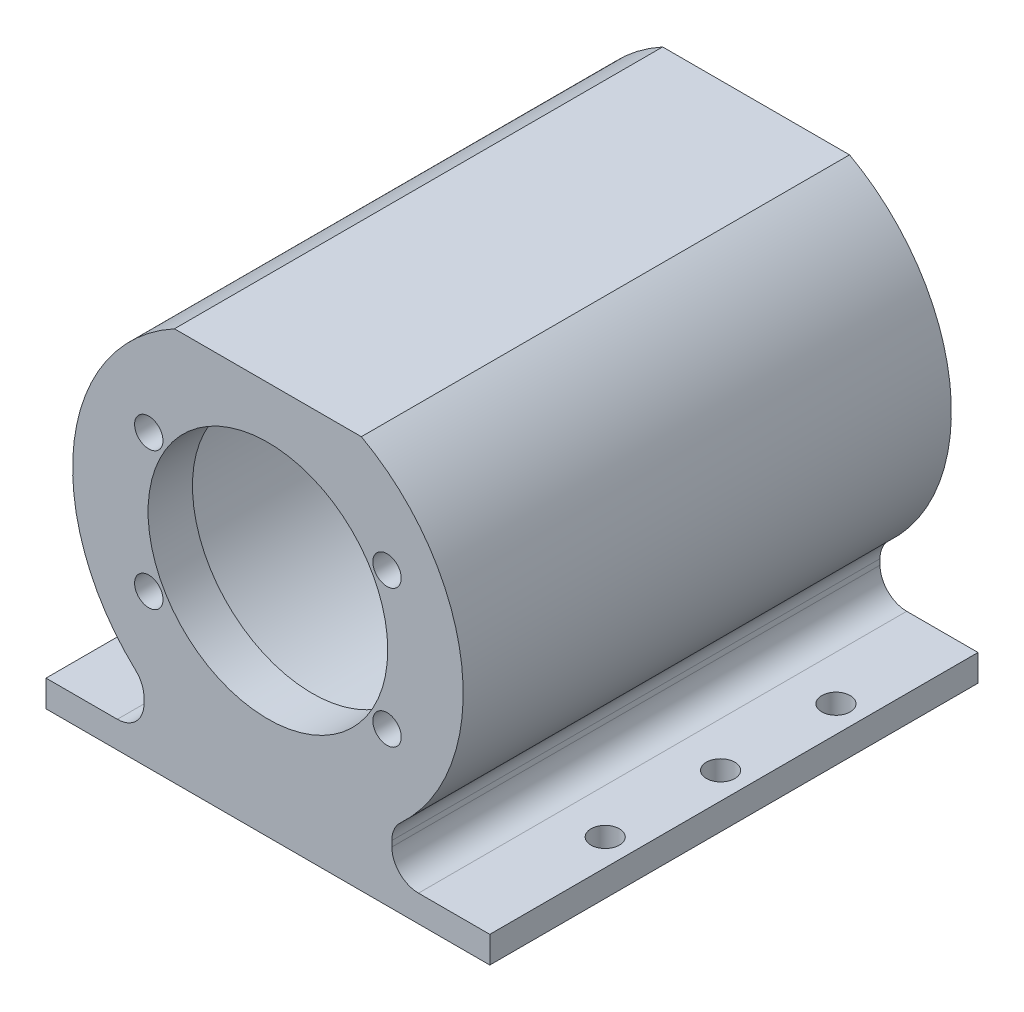
ISO-10303-21;
HEADER;
FILE_DESCRIPTION(('STEP AP214'),'2;1');
FILE_NAME('part.step','',(''),(''),'','','');
FILE_SCHEMA(('AUTOMOTIVE_DESIGN { 1 0 10303 214 1 1 1 1 }'));
ENDSEC;
DATA;
#1=APPLICATION_CONTEXT('core data for automotive mechanical design processes');
#2=APPLICATION_PROTOCOL_DEFINITION('international standard','automotive_design',2000,#1);
#3=PRODUCT_CONTEXT('',#1,'mechanical');
#4=PRODUCT('Part','Part','',(#3));
#5=PRODUCT_RELATED_PRODUCT_CATEGORY('part','',(#4));
#6=PRODUCT_DEFINITION_FORMATION('','',#4);
#7=PRODUCT_DEFINITION_CONTEXT('part definition',#1,'design');
#8=PRODUCT_DEFINITION('design','',#6,#7);
#9=PRODUCT_DEFINITION_SHAPE('','',#8);
#10=(LENGTH_UNIT() NAMED_UNIT(*) SI_UNIT(.MILLI.,.METRE.));
#11=(NAMED_UNIT(*) PLANE_ANGLE_UNIT() SI_UNIT($,.RADIAN.));
#12=(NAMED_UNIT(*) SI_UNIT($,.STERADIAN.) SOLID_ANGLE_UNIT());
#13=UNCERTAINTY_MEASURE_WITH_UNIT(LENGTH_MEASURE(1.E-05),#10,'distance_accuracy_value','');
#14=(GEOMETRIC_REPRESENTATION_CONTEXT(3) GLOBAL_UNCERTAINTY_ASSIGNED_CONTEXT((#13)) GLOBAL_UNIT_ASSIGNED_CONTEXT((#10,
#11,#12)) REPRESENTATION_CONTEXT('',''));
#15=CARTESIAN_POINT('',(0.,0.,0.));
#16=DIRECTION('',(0.,0.,1.));
#17=DIRECTION('',(1.,0.,0.));
#18=AXIS2_PLACEMENT_3D('',#15,#16,#17);
#19=CARTESIAN_POINT('',(0.,23.5,55.));
#20=DIRECTION('',(0.,0.,-1.));
#21=DIRECTION('',(-1.,0.,0.));
#22=AXIS2_PLACEMENT_3D('',#19,#20,#21);
#23=CYLINDRICAL_SURFACE('',#22,18.65);
#24=CARTESIAN_POINT('',(0.,23.5,0.));
#25=DIRECTION('',(0.,0.,1.));
#26=DIRECTION('',(1.,0.,0.));
#27=AXIS2_PLACEMENT_3D('',#24,#25,#26);
#28=CIRCLE('',#27,18.65);
#29=CARTESIAN_POINT('',(18.65,23.5,0.));
#30=VERTEX_POINT('',#29);
#31=EDGE_CURVE('E233',#30,#30,#28,.T.);
#32=ORIENTED_EDGE('',*,*,#31,.F.);
#33=EDGE_LOOP('',(#32));
#34=FACE_BOUND('',#33,.T.);
#35=CARTESIAN_POINT('',(0.,23.5,50.));
#36=DIRECTION('',(0.,0.,1.));
#37=DIRECTION('',(1.,0.,0.));
#38=AXIS2_PLACEMENT_3D('',#35,#36,#37);
#39=CIRCLE('',#38,18.65);
#40=CARTESIAN_POINT('',(18.65,23.5,50.));
#41=VERTEX_POINT('',#40);
#42=EDGE_CURVE('E383',#41,#41,#39,.T.);
#43=ORIENTED_EDGE('',*,*,#42,.T.);
#44=EDGE_LOOP('',(#43));
#45=FACE_BOUND('',#44,.T.);
#46=ADVANCED_FACE('F47',(#34,#45),#23,.F.);
#47=CARTESIAN_POINT('',(0.,1.5,55.));
#48=DIRECTION('',(0.,1.,0.));
#49=DIRECTION('',(0.,0.,1.));
#50=AXIS2_PLACEMENT_3D('',#47,#48,#49);
#51=PLANE('',#50);
#52=CARTESIAN_POINT('',(22.,1.5,13.));
#53=DIRECTION('',(0.,1.,0.));
#54=DIRECTION('',(0.,0.,1.));
#55=AXIS2_PLACEMENT_3D('',#52,#53,#54);
#56=CIRCLE('',#55,1.6);
#57=CARTESIAN_POINT('',(22.,1.5,14.6));
#58=VERTEX_POINT('',#57);
#59=EDGE_CURVE('E313',#58,#58,#56,.T.);
#60=ORIENTED_EDGE('',*,*,#59,.F.);
#61=EDGE_LOOP('',(#60));
#62=FACE_BOUND('',#61,.T.);
#63=CARTESIAN_POINT('',(22.,1.5,26.));
#64=DIRECTION('',(0.,1.,0.));
#65=DIRECTION('',(0.,0.,1.));
#66=AXIS2_PLACEMENT_3D('',#63,#64,#65);
#67=CIRCLE('',#66,1.6);
#68=CARTESIAN_POINT('',(22.,1.5,27.6));
#69=VERTEX_POINT('',#68);
#70=EDGE_CURVE('E382',#69,#69,#67,.T.);
#71=ORIENTED_EDGE('',*,*,#70,.F.);
#72=EDGE_LOOP('',(#71));
#73=FACE_BOUND('',#72,.T.);
#74=CARTESIAN_POINT('',(22.,1.5,39.));
#75=DIRECTION('',(0.,1.,0.));
#76=DIRECTION('',(0.,0.,1.));
#77=AXIS2_PLACEMENT_3D('',#74,#75,#76);
#78=CIRCLE('',#77,1.6);
#79=CARTESIAN_POINT('',(22.,1.5,40.6));
#80=VERTEX_POINT('',#79);
#81=EDGE_CURVE('E378',#80,#80,#78,.T.);
#82=ORIENTED_EDGE('',*,*,#81,.F.);
#83=EDGE_LOOP('',(#82));
#84=FACE_BOUND('',#83,.T.);
#85=DIRECTION('',(1.,0.,0.));
#86=VECTOR('',#85,1.);
#87=CARTESIAN_POINT('',(0.,1.5,0.));
#88=LINE('',#87,#86);
#89=CARTESIAN_POINT('',(16.9642400437689,1.5,0.));
#90=VERTEX_POINT('',#89);
#91=CARTESIAN_POINT('',(25.,1.5,0.));
#92=VERTEX_POINT('',#91);
#93=EDGE_CURVE('E203',#90,#92,#88,.T.);
#94=ORIENTED_EDGE('',*,*,#93,.F.);
#95=DIRECTION('',(0.,0.,-1.));
#96=VECTOR('',#95,1.);
#97=CARTESIAN_POINT('',(16.9642400437689,1.5,55.));
#98=LINE('',#97,#96);
#99=CARTESIAN_POINT('',(16.9642400437689,1.5,55.));
#100=VERTEX_POINT('',#99);
#101=EDGE_CURVE('E259',#90,#100,#98,.F.);
#102=ORIENTED_EDGE('',*,*,#101,.T.);
#103=DIRECTION('',(1.,0.,0.));
#104=VECTOR('',#103,1.);
#105=CARTESIAN_POINT('',(0.,1.5,55.));
#106=LINE('',#105,#104);
#107=CARTESIAN_POINT('',(25.,1.5,55.));
#108=VERTEX_POINT('',#107);
#109=EDGE_CURVE('E237',#100,#108,#106,.T.);
#110=ORIENTED_EDGE('',*,*,#109,.T.);
#111=DIRECTION('',(0.,0.,-1.));
#112=VECTOR('',#111,1.);
#113=CARTESIAN_POINT('',(25.,1.5,55.));
#114=LINE('',#113,#112);
#115=EDGE_CURVE('E202',#108,#92,#114,.T.);
#116=ORIENTED_EDGE('',*,*,#115,.T.);
#117=EDGE_LOOP('',(#94,#102,#110,#116));
#118=FACE_BOUND('',#117,.T.);
#119=ADVANCED_FACE('F351',(#62,#73,#84,#118),#51,.T.);
#120=CARTESIAN_POINT('',(13.9642400437689,0.,55.));
#121=DIRECTION('',(1.,0.,0.));
#122=DIRECTION('',(0.,0.,-1.));
#123=AXIS2_PLACEMENT_3D('',#120,#121,#122);
#124=PLANE('',#123);
#125=DIRECTION('',(0.,-1.,0.));
#126=VECTOR('',#125,1.);
#127=CARTESIAN_POINT('',(13.9642400437689,0.,55.));
#128=LINE('',#127,#126);
#129=CARTESIAN_POINT('',(13.9642400437689,5.13659727236299,55.));
#130=VERTEX_POINT('',#129);
#131=CARTESIAN_POINT('',(13.9642400437689,4.5,55.));
#132=VERTEX_POINT('',#131);
#133=EDGE_CURVE('E165',#130,#132,#128,.T.);
#134=ORIENTED_EDGE('',*,*,#133,.T.);
#135=DIRECTION('',(0.,0.,-1.));
#136=VECTOR('',#135,1.);
#137=CARTESIAN_POINT('',(13.9642400437689,4.5,0.));
#138=LINE('',#137,#136);
#139=CARTESIAN_POINT('',(13.9642400437689,4.5,0.));
#140=VERTEX_POINT('',#139);
#141=EDGE_CURVE('E255',#132,#140,#138,.T.);
#142=ORIENTED_EDGE('',*,*,#141,.T.);
#143=DIRECTION('',(0.,-1.,0.));
#144=VECTOR('',#143,1.);
#145=CARTESIAN_POINT('',(13.9642400437689,0.,0.));
#146=LINE('',#145,#144);
#147=CARTESIAN_POINT('',(13.9642400437689,5.13659727236299,0.));
#148=VERTEX_POINT('',#147);
#149=EDGE_CURVE('E206',#148,#140,#146,.T.);
#150=ORIENTED_EDGE('',*,*,#149,.F.);
#151=DIRECTION('',(0.,0.,-1.));
#152=VECTOR('',#151,1.);
#153=CARTESIAN_POINT('',(13.9642400437689,5.13659727236299,55.));
#154=LINE('',#153,#152);
#155=EDGE_CURVE('E177',#148,#130,#154,.F.);
#156=ORIENTED_EDGE('',*,*,#155,.T.);
#157=EDGE_LOOP('',(#134,#142,#150,#156));
#158=FACE_BOUND('',#157,.T.);
#159=ADVANCED_FACE('F339',(#158),#124,.T.);
#160=CARTESIAN_POINT('',(0.,23.5,55.));
#161=DIRECTION('',(0.,0.,-1.));
#162=DIRECTION('',(-1.,0.,0.));
#163=AXIS2_PLACEMENT_3D('',#160,#161,#162);
#164=CYLINDRICAL_SURFACE('',#163,22.);
#165=CARTESIAN_POINT('',(0.,23.5,55.));
#166=DIRECTION('',(0.,0.,1.));
#167=DIRECTION('',(1.,0.,0.));
#168=AXIS2_PLACEMENT_3D('',#165,#166,#167);
#169=CIRCLE('',#168,22.);
#170=CARTESIAN_POINT('',(14.9285312385167,7.34020559967943,55.));
#171=VERTEX_POINT('',#170);
#172=CARTESIAN_POINT('',(10.5287479608846,42.8169735304516,55.));
#173=VERTEX_POINT('',#172);
#174=EDGE_CURVE('E151',#171,#173,#169,.T.);
#175=ORIENTED_EDGE('',*,*,#174,.F.);
#176=DIRECTION('',(0.,0.,-1.));
#177=VECTOR('',#176,1.);
#178=CARTESIAN_POINT('',(14.9285312385167,7.34020559967943,55.));
#179=LINE('',#178,#177);
#180=CARTESIAN_POINT('',(14.9285312385167,7.34020559967943,0.));
#181=VERTEX_POINT('',#180);
#182=EDGE_CURVE('E262',#171,#181,#179,.T.);
#183=ORIENTED_EDGE('',*,*,#182,.T.);
#184=CARTESIAN_POINT('',(0.,23.5,0.));
#185=DIRECTION('',(0.,0.,1.));
#186=DIRECTION('',(1.,0.,0.));
#187=AXIS2_PLACEMENT_3D('',#184,#185,#186);
#188=CIRCLE('',#187,22.);
#189=CARTESIAN_POINT('',(10.5287479608846,42.8169735304516,0.));
#190=VERTEX_POINT('',#189);
#191=EDGE_CURVE('E172',#181,#190,#188,.T.);
#192=ORIENTED_EDGE('',*,*,#191,.T.);
#193=DIRECTION('',(0.,0.,-1.));
#194=VECTOR('',#193,1.);
#195=CARTESIAN_POINT('',(10.5287479608846,42.8169735304516,55.));
#196=LINE('',#195,#194);
#197=EDGE_CURVE('E169',#173,#190,#196,.T.);
#198=ORIENTED_EDGE('',*,*,#197,.F.);
#199=EDGE_LOOP('',(#175,#183,#192,#198));
#200=FACE_BOUND('',#199,.T.);
#201=ADVANCED_FACE('F170',(#200),#164,.T.);
#202=CARTESIAN_POINT('',(0.,42.8169735304516,55.));
#203=DIRECTION('',(0.,1.,0.));
#204=DIRECTION('',(0.,0.,1.));
#205=AXIS2_PLACEMENT_3D('',#202,#203,#204);
#206=PLANE('',#205);
#207=DIRECTION('',(1.,0.,0.));
#208=VECTOR('',#207,1.);
#209=CARTESIAN_POINT('',(0.,42.8169735304516,0.));
#210=LINE('',#209,#208);
#211=CARTESIAN_POINT('',(-10.5287479608846,42.8169735304516,0.));
#212=VERTEX_POINT('',#211);
#213=EDGE_CURVE('E214',#212,#190,#210,.T.);
#214=ORIENTED_EDGE('',*,*,#213,.F.);
#215=DIRECTION('',(0.,0.,-1.));
#216=VECTOR('',#215,1.);
#217=CARTESIAN_POINT('',(-10.5287479608846,42.8169735304516,55.));
#218=LINE('',#217,#216);
#219=CARTESIAN_POINT('',(-10.5287479608846,42.8169735304516,55.));
#220=VERTEX_POINT('',#219);
#221=EDGE_CURVE('E178',#220,#212,#218,.T.);
#222=ORIENTED_EDGE('',*,*,#221,.F.);
#223=DIRECTION('',(1.,0.,0.));
#224=VECTOR('',#223,1.);
#225=CARTESIAN_POINT('',(0.,42.8169735304516,55.));
#226=LINE('',#225,#224);
#227=EDGE_CURVE('E157',#220,#173,#226,.T.);
#228=ORIENTED_EDGE('',*,*,#227,.T.);
#229=ORIENTED_EDGE('',*,*,#197,.T.);
#230=EDGE_LOOP('',(#214,#222,#228,#229));
#231=FACE_BOUND('',#230,.T.);
#232=ADVANCED_FACE('F180',(#231),#206,.T.);
#233=CARTESIAN_POINT('',(-14.9285312385167,7.34020559967943,0.));
#234=VERTEX_POINT('',#233);
#235=EDGE_CURVE('E215',#212,#234,#188,.T.);
#236=ORIENTED_EDGE('',*,*,#235,.T.);
#237=DIRECTION('',(0.,0.,-1.));
#238=VECTOR('',#237,1.);
#239=CARTESIAN_POINT('',(-14.9285312385167,7.34020559967943,55.));
#240=LINE('',#239,#238);
#241=CARTESIAN_POINT('',(-14.9285312385167,7.34020559967943,55.));
#242=VERTEX_POINT('',#241);
#243=EDGE_CURVE('E65',#234,#242,#240,.F.);
#244=ORIENTED_EDGE('',*,*,#243,.T.);
#245=EDGE_CURVE('E167',#220,#242,#169,.T.);
#246=ORIENTED_EDGE('',*,*,#245,.F.);
#247=ORIENTED_EDGE('',*,*,#221,.T.);
#248=EDGE_LOOP('',(#236,#244,#246,#247));
#249=FACE_BOUND('',#248,.T.);
#250=ADVANCED_FACE('F494',(#249),#164,.T.);
#251=CARTESIAN_POINT('',(-13.9642400437689,0.,55.));
#252=DIRECTION('',(1.,0.,0.));
#253=DIRECTION('',(0.,0.,-1.));
#254=AXIS2_PLACEMENT_3D('',#251,#252,#253);
#255=PLANE('',#254);
#256=DIRECTION('',(0.,-1.,0.));
#257=VECTOR('',#256,1.);
#258=CARTESIAN_POINT('',(-13.9642400437689,0.,0.));
#259=LINE('',#258,#257);
#260=CARTESIAN_POINT('',(-13.9642400437689,5.13659727236299,0.));
#261=VERTEX_POINT('',#260);
#262=CARTESIAN_POINT('',(-13.9642400437689,4.5,0.));
#263=VERTEX_POINT('',#262);
#264=EDGE_CURVE('E218',#261,#263,#259,.T.);
#265=ORIENTED_EDGE('',*,*,#264,.T.);
#266=DIRECTION('',(0.,0.,-1.));
#267=VECTOR('',#266,1.);
#268=CARTESIAN_POINT('',(-13.9642400437689,4.5,55.));
#269=LINE('',#268,#267);
#270=CARTESIAN_POINT('',(-13.9642400437689,4.5,55.));
#271=VERTEX_POINT('',#270);
#272=EDGE_CURVE('E284',#263,#271,#269,.F.);
#273=ORIENTED_EDGE('',*,*,#272,.T.);
#274=DIRECTION('',(0.,-1.,0.));
#275=VECTOR('',#274,1.);
#276=CARTESIAN_POINT('',(-13.9642400437689,0.,55.));
#277=LINE('',#276,#275);
#278=CARTESIAN_POINT('',(-13.9642400437689,5.13659727236299,55.));
#279=VERTEX_POINT('',#278);
#280=EDGE_CURVE('E184',#279,#271,#277,.T.);
#281=ORIENTED_EDGE('',*,*,#280,.F.);
#282=DIRECTION('',(0.,0.,1.));
#283=VECTOR('',#282,1.);
#284=CARTESIAN_POINT('',(-13.9642400437689,5.13659727236299,0.));
#285=LINE('',#284,#283);
#286=EDGE_CURVE('E280',#279,#261,#285,.F.);
#287=ORIENTED_EDGE('',*,*,#286,.T.);
#288=EDGE_LOOP('',(#265,#273,#281,#287));
#289=FACE_BOUND('',#288,.T.);
#290=ADVANCED_FACE('F490',(#289),#255,.F.);
#291=CARTESIAN_POINT('',(-22.,1.5,13.));
#292=DIRECTION('',(0.,1.,0.));
#293=DIRECTION('',(0.,0.,1.));
#294=AXIS2_PLACEMENT_3D('',#291,#292,#293);
#295=CIRCLE('',#294,1.6);
#296=CARTESIAN_POINT('',(-22.,1.5,14.6));
#297=VERTEX_POINT('',#296);
#298=EDGE_CURVE('E302',#297,#297,#295,.T.);
#299=ORIENTED_EDGE('',*,*,#298,.F.);
#300=EDGE_LOOP('',(#299));
#301=FACE_BOUND('',#300,.T.);
#302=CARTESIAN_POINT('',(-22.,1.5,26.));
#303=DIRECTION('',(0.,1.,0.));
#304=DIRECTION('',(0.,0.,1.));
#305=AXIS2_PLACEMENT_3D('',#302,#303,#304);
#306=CIRCLE('',#305,1.6);
#307=CARTESIAN_POINT('',(-22.,1.5,27.6));
#308=VERTEX_POINT('',#307);
#309=EDGE_CURVE('E325',#308,#308,#306,.T.);
#310=ORIENTED_EDGE('',*,*,#309,.F.);
#311=EDGE_LOOP('',(#310));
#312=FACE_BOUND('',#311,.T.);
#313=CARTESIAN_POINT('',(-22.,1.5,39.));
#314=DIRECTION('',(0.,1.,0.));
#315=DIRECTION('',(0.,0.,1.));
#316=AXIS2_PLACEMENT_3D('',#313,#314,#315);
#317=CIRCLE('',#316,1.6);
#318=CARTESIAN_POINT('',(-22.,1.5,40.6));
#319=VERTEX_POINT('',#318);
#320=EDGE_CURVE('E320',#319,#319,#317,.T.);
#321=ORIENTED_EDGE('',*,*,#320,.F.);
#322=EDGE_LOOP('',(#321));
#323=FACE_BOUND('',#322,.T.);
#324=CARTESIAN_POINT('',(-25.,1.5,55.));
#325=VERTEX_POINT('',#324);
#326=CARTESIAN_POINT('',(-16.9642400437689,1.5,55.));
#327=VERTEX_POINT('',#326);
#328=EDGE_CURVE('E190',#325,#327,#106,.T.);
#329=ORIENTED_EDGE('',*,*,#328,.T.);
#330=DIRECTION('',(0.,0.,-1.));
#331=VECTOR('',#330,1.);
#332=CARTESIAN_POINT('',(-16.9642400437689,1.5,55.));
#333=LINE('',#332,#331);
#334=CARTESIAN_POINT('',(-16.9642400437689,1.5,0.));
#335=VERTEX_POINT('',#334);
#336=EDGE_CURVE('E276',#327,#335,#333,.T.);
#337=ORIENTED_EDGE('',*,*,#336,.T.);
#338=CARTESIAN_POINT('',(-25.,1.5,0.));
#339=VERTEX_POINT('',#338);
#340=EDGE_CURVE('E208',#339,#335,#88,.T.);
#341=ORIENTED_EDGE('',*,*,#340,.F.);
#342=DIRECTION('',(0.,0.,-1.));
#343=VECTOR('',#342,1.);
#344=CARTESIAN_POINT('',(-25.,1.5,55.));
#345=LINE('',#344,#343);
#346=EDGE_CURVE('E248',#325,#339,#345,.T.);
#347=ORIENTED_EDGE('',*,*,#346,.F.);
#348=EDGE_LOOP('',(#329,#337,#341,#347));
#349=FACE_BOUND('',#348,.T.);
#350=ADVANCED_FACE('F369',(#301,#312,#323,#349),#51,.T.);
#351=CARTESIAN_POINT('',(-25.,0.,55.));
#352=DIRECTION('',(-1.,0.,0.));
#353=DIRECTION('',(0.,0.,1.));
#354=AXIS2_PLACEMENT_3D('',#351,#352,#353);
#355=PLANE('',#354);
#356=DIRECTION('',(0.,1.,0.));
#357=VECTOR('',#356,1.);
#358=CARTESIAN_POINT('',(-25.,0.,0.));
#359=LINE('',#358,#357);
#360=CARTESIAN_POINT('',(-25.,-1.5,0.));
#361=VERTEX_POINT('',#360);
#362=EDGE_CURVE('E222',#361,#339,#359,.T.);
#363=ORIENTED_EDGE('',*,*,#362,.F.);
#364=DIRECTION('',(0.,0.,-1.));
#365=VECTOR('',#364,1.);
#366=CARTESIAN_POINT('',(-25.,-1.5,55.));
#367=LINE('',#366,#365);
#368=CARTESIAN_POINT('',(-25.,-1.5,55.));
#369=VERTEX_POINT('',#368);
#370=EDGE_CURVE('E245',#369,#361,#367,.T.);
#371=ORIENTED_EDGE('',*,*,#370,.F.);
#372=DIRECTION('',(0.,1.,0.));
#373=VECTOR('',#372,1.);
#374=CARTESIAN_POINT('',(-25.,0.,55.));
#375=LINE('',#374,#373);
#376=EDGE_CURVE('E191',#369,#325,#375,.T.);
#377=ORIENTED_EDGE('',*,*,#376,.T.);
#378=ORIENTED_EDGE('',*,*,#346,.T.);
#379=EDGE_LOOP('',(#363,#371,#377,#378));
#380=FACE_BOUND('',#379,.T.);
#381=ADVANCED_FACE('F362',(#380),#355,.T.);
#382=CARTESIAN_POINT('',(0.,-1.5,55.));
#383=DIRECTION('',(0.,1.,0.));
#384=DIRECTION('',(0.,0.,1.));
#385=AXIS2_PLACEMENT_3D('',#382,#383,#384);
#386=PLANE('',#385);
#387=CARTESIAN_POINT('',(22.,-1.5,13.));
#388=DIRECTION('',(0.,1.,0.));
#389=DIRECTION('',(0.,0.,1.));
#390=AXIS2_PLACEMENT_3D('',#387,#388,#389);
#391=CIRCLE('',#390,1.6);
#392=CARTESIAN_POINT('',(22.,-1.5,14.6));
#393=VERTEX_POINT('',#392);
#394=EDGE_CURVE('E51',#393,#393,#391,.T.);
#395=ORIENTED_EDGE('',*,*,#394,.T.);
#396=EDGE_LOOP('',(#395));
#397=FACE_BOUND('',#396,.T.);
#398=CARTESIAN_POINT('',(22.,-1.5,26.));
#399=DIRECTION('',(0.,1.,0.));
#400=DIRECTION('',(0.,0.,1.));
#401=AXIS2_PLACEMENT_3D('',#398,#399,#400);
#402=CIRCLE('',#401,1.6);
#403=CARTESIAN_POINT('',(22.,-1.5,27.6));
#404=VERTEX_POINT('',#403);
#405=EDGE_CURVE('E312',#404,#404,#402,.T.);
#406=ORIENTED_EDGE('',*,*,#405,.T.);
#407=EDGE_LOOP('',(#406));
#408=FACE_BOUND('',#407,.T.);
#409=CARTESIAN_POINT('',(22.,-1.5,39.));
#410=DIRECTION('',(0.,1.,0.));
#411=DIRECTION('',(0.,0.,1.));
#412=AXIS2_PLACEMENT_3D('',#409,#410,#411);
#413=CIRCLE('',#412,1.6);
#414=CARTESIAN_POINT('',(22.,-1.5,40.6));
#415=VERTEX_POINT('',#414);
#416=EDGE_CURVE('E309',#415,#415,#413,.T.);
#417=ORIENTED_EDGE('',*,*,#416,.T.);
#418=EDGE_LOOP('',(#417));
#419=FACE_BOUND('',#418,.T.);
#420=CARTESIAN_POINT('',(-22.,-1.5,13.));
#421=DIRECTION('',(0.,1.,0.));
#422=DIRECTION('',(0.,0.,1.));
#423=AXIS2_PLACEMENT_3D('',#420,#421,#422);
#424=CIRCLE('',#423,1.6);
#425=CARTESIAN_POINT('',(-22.,-1.5,14.6));
#426=VERTEX_POINT('',#425);
#427=EDGE_CURVE('E207',#426,#426,#424,.T.);
#428=ORIENTED_EDGE('',*,*,#427,.T.);
#429=EDGE_LOOP('',(#428));
#430=FACE_BOUND('',#429,.T.);
#431=CARTESIAN_POINT('',(-22.,-1.5,26.));
#432=DIRECTION('',(0.,1.,0.));
#433=DIRECTION('',(0.,0.,1.));
#434=AXIS2_PLACEMENT_3D('',#431,#432,#433);
#435=CIRCLE('',#434,1.6);
#436=CARTESIAN_POINT('',(-22.,-1.5,27.6));
#437=VERTEX_POINT('',#436);
#438=EDGE_CURVE('E301',#437,#437,#435,.T.);
#439=ORIENTED_EDGE('',*,*,#438,.T.);
#440=EDGE_LOOP('',(#439));
#441=FACE_BOUND('',#440,.T.);
#442=CARTESIAN_POINT('',(-22.,-1.5,39.));
#443=DIRECTION('',(0.,1.,0.));
#444=DIRECTION('',(0.,0.,1.));
#445=AXIS2_PLACEMENT_3D('',#442,#443,#444);
#446=CIRCLE('',#445,1.6);
#447=CARTESIAN_POINT('',(-22.,-1.5,40.6));
#448=VERTEX_POINT('',#447);
#449=EDGE_CURVE('E297',#448,#448,#446,.T.);
#450=ORIENTED_EDGE('',*,*,#449,.T.);
#451=EDGE_LOOP('',(#450));
#452=FACE_BOUND('',#451,.T.);
#453=DIRECTION('',(1.,0.,0.));
#454=VECTOR('',#453,1.);
#455=CARTESIAN_POINT('',(0.,-1.5,0.));
#456=LINE('',#455,#454);
#457=CARTESIAN_POINT('',(25.,-1.5,0.));
#458=VERTEX_POINT('',#457);
#459=EDGE_CURVE('E226',#361,#458,#456,.T.);
#460=ORIENTED_EDGE('',*,*,#459,.T.);
#461=DIRECTION('',(0.,0.,-1.));
#462=VECTOR('',#461,1.);
#463=CARTESIAN_POINT('',(25.,-1.5,55.));
#464=LINE('',#463,#462);
#465=CARTESIAN_POINT('',(25.,-1.5,55.));
#466=VERTEX_POINT('',#465);
#467=EDGE_CURVE('E241',#466,#458,#464,.T.);
#468=ORIENTED_EDGE('',*,*,#467,.F.);
#469=DIRECTION('',(1.,0.,0.));
#470=VECTOR('',#469,1.);
#471=CARTESIAN_POINT('',(0.,-1.5,55.));
#472=LINE('',#471,#470);
#473=EDGE_CURVE('E195',#369,#466,#472,.T.);
#474=ORIENTED_EDGE('',*,*,#473,.F.);
#475=ORIENTED_EDGE('',*,*,#370,.T.);
#476=EDGE_LOOP('',(#460,#468,#474,#475));
#477=FACE_BOUND('',#476,.T.);
#478=ADVANCED_FACE('F484',(#397,#408,#419,#430,#441,#452,#477),#386,.F.);
#479=CARTESIAN_POINT('',(25.,0.,55.));
#480=DIRECTION('',(-1.,0.,0.));
#481=DIRECTION('',(0.,0.,1.));
#482=AXIS2_PLACEMENT_3D('',#479,#480,#481);
#483=PLANE('',#482);
#484=DIRECTION('',(0.,1.,0.));
#485=VECTOR('',#484,1.);
#486=CARTESIAN_POINT('',(25.,0.,0.));
#487=LINE('',#486,#485);
#488=EDGE_CURVE('E229',#458,#92,#487,.T.);
#489=ORIENTED_EDGE('',*,*,#488,.T.);
#490=ORIENTED_EDGE('',*,*,#115,.F.);
#491=DIRECTION('',(0.,1.,0.));
#492=VECTOR('',#491,1.);
#493=CARTESIAN_POINT('',(25.,0.,55.));
#494=LINE('',#493,#492);
#495=EDGE_CURVE('E198',#466,#108,#494,.T.);
#496=ORIENTED_EDGE('',*,*,#495,.F.);
#497=ORIENTED_EDGE('',*,*,#467,.T.);
#498=EDGE_LOOP('',(#489,#490,#496,#497));
#499=FACE_BOUND('',#498,.T.);
#500=ADVANCED_FACE('F355',(#499),#483,.F.);
#501=CARTESIAN_POINT('',(0.,0.,55.));
#502=DIRECTION('',(0.,0.,1.));
#503=DIRECTION('',(1.,0.,0.));
#504=AXIS2_PLACEMENT_3D('',#501,#502,#503);
#505=PLANE('',#504);
#506=ORIENTED_EDGE('',*,*,#109,.F.);
#507=CARTESIAN_POINT('',(16.9642400437689,4.5,55.));
#508=DIRECTION('',(0.,0.,1.));
#509=DIRECTION('',(1.,0.,0.));
#510=AXIS2_PLACEMENT_3D('',#507,#508,#509);
#511=CIRCLE('',#510,3.);
#512=EDGE_CURVE('E268',#100,#132,#511,.F.);
#513=ORIENTED_EDGE('',*,*,#512,.T.);
#514=ORIENTED_EDGE('',*,*,#133,.F.);
#515=CARTESIAN_POINT('',(16.9642400437689,5.13659727236299,55.));
#516=DIRECTION('',(0.,0.,1.));
#517=DIRECTION('',(1.,0.,0.));
#518=AXIS2_PLACEMENT_3D('',#515,#516,#517);
#519=CIRCLE('',#518,3.);
#520=EDGE_CURVE('E160',#130,#171,#519,.F.);
#521=ORIENTED_EDGE('',*,*,#520,.T.);
#522=ORIENTED_EDGE('',*,*,#174,.T.);
#523=ORIENTED_EDGE('',*,*,#227,.F.);
#524=ORIENTED_EDGE('',*,*,#245,.T.);
#525=CARTESIAN_POINT('',(-16.9642400437689,5.13659727236299,55.));
#526=DIRECTION('',(0.,0.,1.));
#527=DIRECTION('',(1.,0.,0.));
#528=AXIS2_PLACEMENT_3D('',#525,#526,#527);
#529=CIRCLE('',#528,3.);
#530=EDGE_CURVE('E11',#242,#279,#529,.F.);
#531=ORIENTED_EDGE('',*,*,#530,.T.);
#532=ORIENTED_EDGE('',*,*,#280,.T.);
#533=CARTESIAN_POINT('',(-16.9642400437689,4.5,55.));
#534=DIRECTION('',(0.,0.,1.));
#535=DIRECTION('',(1.,0.,0.));
#536=AXIS2_PLACEMENT_3D('',#533,#534,#535);
#537=CIRCLE('',#536,3.);
#538=EDGE_CURVE('E292',#271,#327,#537,.F.);
#539=ORIENTED_EDGE('',*,*,#538,.T.);
#540=ORIENTED_EDGE('',*,*,#328,.F.);
#541=ORIENTED_EDGE('',*,*,#376,.F.);
#542=ORIENTED_EDGE('',*,*,#473,.T.);
#543=ORIENTED_EDGE('',*,*,#495,.T.);
#544=EDGE_LOOP('',(#506,#513,#514,#521,#522,#523,#524,#531,#532,#539,#540,#541,#542,#543));
#545=FACE_BOUND('',#544,.T.);
#546=CARTESIAN_POINT('',(13.42,15.75,55.));
#547=DIRECTION('',(0.,0.,1.));
#548=DIRECTION('',(1.,0.,0.));
#549=AXIS2_PLACEMENT_3D('',#546,#547,#548);
#550=CIRCLE('',#549,1.6);
#551=CARTESIAN_POINT('',(15.02,15.75,55.));
#552=VERTEX_POINT('',#551);
#553=EDGE_CURVE('E426',#552,#552,#550,.T.);
#554=ORIENTED_EDGE('',*,*,#553,.F.);
#555=EDGE_LOOP('',(#554));
#556=FACE_BOUND('',#555,.T.);
#557=CARTESIAN_POINT('',(13.42,31.25,55.));
#558=DIRECTION('',(0.,0.,1.));
#559=DIRECTION('',(1.,0.,0.));
#560=AXIS2_PLACEMENT_3D('',#557,#558,#559);
#561=CIRCLE('',#560,1.6);
#562=CARTESIAN_POINT('',(15.02,31.25,55.));
#563=VERTEX_POINT('',#562);
#564=EDGE_CURVE('E418',#563,#563,#561,.T.);
#565=ORIENTED_EDGE('',*,*,#564,.F.);
#566=EDGE_LOOP('',(#565));
#567=FACE_BOUND('',#566,.T.);
#568=CARTESIAN_POINT('',(-13.42,15.75,55.));
#569=DIRECTION('',(0.,0.,1.));
#570=DIRECTION('',(1.,0.,0.));
#571=AXIS2_PLACEMENT_3D('',#568,#569,#570);
#572=CIRCLE('',#571,1.6);
#573=CARTESIAN_POINT('',(-11.82,15.75,55.));
#574=VERTEX_POINT('',#573);
#575=EDGE_CURVE('E410',#574,#574,#572,.T.);
#576=ORIENTED_EDGE('',*,*,#575,.F.);
#577=EDGE_LOOP('',(#576));
#578=FACE_BOUND('',#577,.T.);
#579=CARTESIAN_POINT('',(-13.42,31.25,55.));
#580=DIRECTION('',(0.,0.,1.));
#581=DIRECTION('',(1.,0.,0.));
#582=AXIS2_PLACEMENT_3D('',#579,#580,#581);
#583=CIRCLE('',#582,1.6);
#584=CARTESIAN_POINT('',(-11.82,31.25,55.));
#585=VERTEX_POINT('',#584);
#586=EDGE_CURVE('E402',#585,#585,#583,.T.);
#587=ORIENTED_EDGE('',*,*,#586,.F.);
#588=EDGE_LOOP('',(#587));
#589=FACE_BOUND('',#588,.T.);
#590=CARTESIAN_POINT('',(0.,23.5,55.));
#591=DIRECTION('',(0.,0.,1.));
#592=DIRECTION('',(1.,0.,0.));
#593=AXIS2_PLACEMENT_3D('',#590,#591,#592);
#594=CIRCLE('',#593,13.5);
#595=CARTESIAN_POINT('',(13.5,23.5,55.));
#596=VERTEX_POINT('',#595);
#597=EDGE_CURVE('E394',#596,#596,#594,.T.);
#598=ORIENTED_EDGE('',*,*,#597,.F.);
#599=EDGE_LOOP('',(#598));
#600=FACE_BOUND('',#599,.T.);
#601=ADVANCED_FACE('F154',(#545,#556,#567,#578,#589,#600),#505,.T.);
#602=CARTESIAN_POINT('',(0.,0.,0.));
#603=DIRECTION('',(0.,0.,1.));
#604=DIRECTION('',(1.,0.,0.));
#605=AXIS2_PLACEMENT_3D('',#602,#603,#604);
#606=PLANE('',#605);
#607=ORIENTED_EDGE('',*,*,#149,.T.);
#608=CARTESIAN_POINT('',(16.9642400437689,4.5,0.));
#609=DIRECTION('',(0.,0.,1.));
#610=DIRECTION('',(1.,0.,0.));
#611=AXIS2_PLACEMENT_3D('',#608,#609,#610);
#612=CIRCLE('',#611,3.);
#613=EDGE_CURVE('E265',#140,#90,#612,.T.);
#614=ORIENTED_EDGE('',*,*,#613,.T.);
#615=ORIENTED_EDGE('',*,*,#93,.T.);
#616=ORIENTED_EDGE('',*,*,#488,.F.);
#617=ORIENTED_EDGE('',*,*,#459,.F.);
#618=ORIENTED_EDGE('',*,*,#362,.T.);
#619=ORIENTED_EDGE('',*,*,#340,.T.);
#620=CARTESIAN_POINT('',(-16.9642400437689,4.5,0.));
#621=DIRECTION('',(0.,0.,1.));
#622=DIRECTION('',(1.,0.,0.));
#623=AXIS2_PLACEMENT_3D('',#620,#621,#622);
#624=CIRCLE('',#623,3.);
#625=EDGE_CURVE('E289',#335,#263,#624,.T.);
#626=ORIENTED_EDGE('',*,*,#625,.T.);
#627=ORIENTED_EDGE('',*,*,#264,.F.);
#628=CARTESIAN_POINT('',(-16.9642400437689,5.13659727236299,0.));
#629=DIRECTION('',(0.,0.,1.));
#630=DIRECTION('',(1.,0.,0.));
#631=AXIS2_PLACEMENT_3D('',#628,#629,#630);
#632=CIRCLE('',#631,3.);
#633=EDGE_CURVE('E57',#261,#234,#632,.T.);
#634=ORIENTED_EDGE('',*,*,#633,.T.);
#635=ORIENTED_EDGE('',*,*,#235,.F.);
#636=ORIENTED_EDGE('',*,*,#213,.T.);
#637=ORIENTED_EDGE('',*,*,#191,.F.);
#638=CARTESIAN_POINT('',(16.9642400437689,5.13659727236299,0.));
#639=DIRECTION('',(0.,0.,1.));
#640=DIRECTION('',(1.,0.,0.));
#641=AXIS2_PLACEMENT_3D('',#638,#639,#640);
#642=CIRCLE('',#641,3.);
#643=EDGE_CURVE('E271',#181,#148,#642,.T.);
#644=ORIENTED_EDGE('',*,*,#643,.T.);
#645=EDGE_LOOP('',(#607,#614,#615,#616,#617,#618,#619,#626,#627,#634,#635,#636,#637,#644));
#646=FACE_BOUND('',#645,.T.);
#647=ORIENTED_EDGE('',*,*,#31,.T.);
#648=EDGE_LOOP('',(#647));
#649=FACE_BOUND('',#648,.T.);
#650=ADVANCED_FACE('F347',(#646,#649),#606,.F.);
#651=CARTESIAN_POINT('',(16.9642400437689,4.5,55.));
#652=DIRECTION('',(0.,0.,1.));
#653=DIRECTION('',(1.,0.,0.));
#654=AXIS2_PLACEMENT_3D('',#651,#652,#653);
#655=CYLINDRICAL_SURFACE('',#654,3.);
#656=ORIENTED_EDGE('',*,*,#512,.F.);
#657=ORIENTED_EDGE('',*,*,#101,.F.);
#658=ORIENTED_EDGE('',*,*,#613,.F.);
#659=ORIENTED_EDGE('',*,*,#141,.F.);
#660=EDGE_LOOP('',(#656,#657,#658,#659));
#661=FACE_BOUND('',#660,.T.);
#662=ADVANCED_FACE('F344',(#661),#655,.F.);
#663=CARTESIAN_POINT('',(16.9642400437689,5.13659727236299,55.));
#664=DIRECTION('',(0.,0.,-1.));
#665=DIRECTION('',(-1.,0.,0.));
#666=AXIS2_PLACEMENT_3D('',#663,#664,#665);
#667=CYLINDRICAL_SURFACE('',#666,3.);
#668=ORIENTED_EDGE('',*,*,#520,.F.);
#669=ORIENTED_EDGE('',*,*,#155,.F.);
#670=ORIENTED_EDGE('',*,*,#643,.F.);
#671=ORIENTED_EDGE('',*,*,#182,.F.);
#672=EDGE_LOOP('',(#668,#669,#670,#671));
#673=FACE_BOUND('',#672,.T.);
#674=ADVANCED_FACE('F504',(#673),#667,.F.);
#675=CARTESIAN_POINT('',(-16.9642400437689,4.5,55.));
#676=DIRECTION('',(0.,0.,-1.));
#677=DIRECTION('',(-1.,0.,0.));
#678=AXIS2_PLACEMENT_3D('',#675,#676,#677);
#679=CYLINDRICAL_SURFACE('',#678,3.);
#680=ORIENTED_EDGE('',*,*,#538,.F.);
#681=ORIENTED_EDGE('',*,*,#272,.F.);
#682=ORIENTED_EDGE('',*,*,#625,.F.);
#683=ORIENTED_EDGE('',*,*,#336,.F.);
#684=EDGE_LOOP('',(#680,#681,#682,#683));
#685=FACE_BOUND('',#684,.T.);
#686=ADVANCED_FACE('F506',(#685),#679,.F.);
#687=CARTESIAN_POINT('',(-16.9642400437689,5.13659727236299,55.));
#688=DIRECTION('',(0.,0.,-1.));
#689=DIRECTION('',(-1.,0.,0.));
#690=AXIS2_PLACEMENT_3D('',#687,#688,#689);
#691=CYLINDRICAL_SURFACE('',#690,3.);
#692=ORIENTED_EDGE('',*,*,#530,.F.);
#693=ORIENTED_EDGE('',*,*,#243,.F.);
#694=ORIENTED_EDGE('',*,*,#633,.F.);
#695=ORIENTED_EDGE('',*,*,#286,.F.);
#696=EDGE_LOOP('',(#692,#693,#694,#695));
#697=FACE_BOUND('',#696,.T.);
#698=ADVANCED_FACE('F49',(#697),#691,.F.);
#699=CARTESIAN_POINT('',(-22.,-53.5,39.));
#700=DIRECTION('',(0.,1.,0.));
#701=DIRECTION('',(0.,0.,1.));
#702=AXIS2_PLACEMENT_3D('',#699,#700,#701);
#703=CYLINDRICAL_SURFACE('',#702,1.6);
#704=ORIENTED_EDGE('',*,*,#320,.T.);
#705=EDGE_LOOP('',(#704));
#706=FACE_BOUND('',#705,.T.);
#707=ORIENTED_EDGE('',*,*,#449,.F.);
#708=EDGE_LOOP('',(#707));
#709=FACE_BOUND('',#708,.T.);
#710=ADVANCED_FACE('F514',(#706,#709),#703,.F.);
#711=CARTESIAN_POINT('',(-22.,-53.5,26.));
#712=DIRECTION('',(0.,1.,0.));
#713=DIRECTION('',(0.,0.,1.));
#714=AXIS2_PLACEMENT_3D('',#711,#712,#713);
#715=CYLINDRICAL_SURFACE('',#714,1.6);
#716=ORIENTED_EDGE('',*,*,#309,.T.);
#717=EDGE_LOOP('',(#716));
#718=FACE_BOUND('',#717,.T.);
#719=ORIENTED_EDGE('',*,*,#438,.F.);
#720=EDGE_LOOP('',(#719));
#721=FACE_BOUND('',#720,.T.);
#722=ADVANCED_FACE('F525',(#718,#721),#715,.F.);
#723=CARTESIAN_POINT('',(-22.,-53.5,13.));
#724=DIRECTION('',(0.,1.,0.));
#725=DIRECTION('',(0.,0.,1.));
#726=AXIS2_PLACEMENT_3D('',#723,#724,#725);
#727=CYLINDRICAL_SURFACE('',#726,1.6);
#728=ORIENTED_EDGE('',*,*,#298,.T.);
#729=EDGE_LOOP('',(#728));
#730=FACE_BOUND('',#729,.T.);
#731=ORIENTED_EDGE('',*,*,#427,.F.);
#732=EDGE_LOOP('',(#731));
#733=FACE_BOUND('',#732,.T.);
#734=ADVANCED_FACE('F530',(#730,#733),#727,.F.);
#735=CARTESIAN_POINT('',(22.,-53.5,39.));
#736=DIRECTION('',(0.,1.,0.));
#737=DIRECTION('',(0.,0.,1.));
#738=AXIS2_PLACEMENT_3D('',#735,#736,#737);
#739=CYLINDRICAL_SURFACE('',#738,1.6);
#740=ORIENTED_EDGE('',*,*,#81,.T.);
#741=EDGE_LOOP('',(#740));
#742=FACE_BOUND('',#741,.T.);
#743=ORIENTED_EDGE('',*,*,#416,.F.);
#744=EDGE_LOOP('',(#743));
#745=FACE_BOUND('',#744,.T.);
#746=ADVANCED_FACE('F537',(#742,#745),#739,.F.);
#747=CARTESIAN_POINT('',(22.,-53.5,26.));
#748=DIRECTION('',(0.,1.,0.));
#749=DIRECTION('',(0.,0.,1.));
#750=AXIS2_PLACEMENT_3D('',#747,#748,#749);
#751=CYLINDRICAL_SURFACE('',#750,1.6);
#752=ORIENTED_EDGE('',*,*,#70,.T.);
#753=EDGE_LOOP('',(#752));
#754=FACE_BOUND('',#753,.T.);
#755=ORIENTED_EDGE('',*,*,#405,.F.);
#756=EDGE_LOOP('',(#755));
#757=FACE_BOUND('',#756,.T.);
#758=ADVANCED_FACE('F540',(#754,#757),#751,.F.);
#759=CARTESIAN_POINT('',(22.,-53.5,13.));
#760=DIRECTION('',(0.,1.,0.));
#761=DIRECTION('',(0.,0.,1.));
#762=AXIS2_PLACEMENT_3D('',#759,#760,#761);
#763=CYLINDRICAL_SURFACE('',#762,1.6);
#764=ORIENTED_EDGE('',*,*,#59,.T.);
#765=EDGE_LOOP('',(#764));
#766=FACE_BOUND('',#765,.T.);
#767=ORIENTED_EDGE('',*,*,#394,.F.);
#768=EDGE_LOOP('',(#767));
#769=FACE_BOUND('',#768,.T.);
#770=ADVANCED_FACE('F466',(#766,#769),#763,.F.);
#771=CARTESIAN_POINT('',(0.,23.5,50.));
#772=DIRECTION('',(0.,0.,1.));
#773=DIRECTION('',(1.,0.,0.));
#774=AXIS2_PLACEMENT_3D('',#771,#772,#773);
#775=PLANE('',#774);
#776=CARTESIAN_POINT('',(13.42,15.75,50.));
#777=DIRECTION('',(0.,0.,1.));
#778=DIRECTION('',(1.,0.,0.));
#779=AXIS2_PLACEMENT_3D('',#776,#777,#778);
#780=CIRCLE('',#779,1.6);
#781=CARTESIAN_POINT('',(15.02,15.75,50.));
#782=VERTEX_POINT('',#781);
#783=EDGE_CURVE('E422',#782,#782,#780,.T.);
#784=ORIENTED_EDGE('',*,*,#783,.T.);
#785=EDGE_LOOP('',(#784));
#786=FACE_BOUND('',#785,.T.);
#787=CARTESIAN_POINT('',(13.42,31.25,50.));
#788=DIRECTION('',(0.,0.,1.));
#789=DIRECTION('',(1.,0.,0.));
#790=AXIS2_PLACEMENT_3D('',#787,#788,#789);
#791=CIRCLE('',#790,1.6);
#792=CARTESIAN_POINT('',(15.02,31.25,50.));
#793=VERTEX_POINT('',#792);
#794=EDGE_CURVE('E414',#793,#793,#791,.T.);
#795=ORIENTED_EDGE('',*,*,#794,.T.);
#796=EDGE_LOOP('',(#795));
#797=FACE_BOUND('',#796,.T.);
#798=CARTESIAN_POINT('',(-13.42,15.75,50.));
#799=DIRECTION('',(0.,0.,1.));
#800=DIRECTION('',(1.,0.,0.));
#801=AXIS2_PLACEMENT_3D('',#798,#799,#800);
#802=CIRCLE('',#801,1.6);
#803=CARTESIAN_POINT('',(-11.82,15.75,50.));
#804=VERTEX_POINT('',#803);
#805=EDGE_CURVE('E406',#804,#804,#802,.T.);
#806=ORIENTED_EDGE('',*,*,#805,.T.);
#807=EDGE_LOOP('',(#806));
#808=FACE_BOUND('',#807,.T.);
#809=CARTESIAN_POINT('',(-13.42,31.25,50.));
#810=DIRECTION('',(0.,0.,1.));
#811=DIRECTION('',(1.,0.,0.));
#812=AXIS2_PLACEMENT_3D('',#809,#810,#811);
#813=CIRCLE('',#812,1.6);
#814=CARTESIAN_POINT('',(-11.82,31.25,50.));
#815=VERTEX_POINT('',#814);
#816=EDGE_CURVE('E398',#815,#815,#813,.T.);
#817=ORIENTED_EDGE('',*,*,#816,.T.);
#818=EDGE_LOOP('',(#817));
#819=FACE_BOUND('',#818,.T.);
#820=CARTESIAN_POINT('',(0.,23.5,50.));
#821=DIRECTION('',(0.,0.,1.));
#822=DIRECTION('',(1.,0.,0.));
#823=AXIS2_PLACEMENT_3D('',#820,#821,#822);
#824=CIRCLE('',#823,13.5);
#825=CARTESIAN_POINT('',(13.5,23.5,50.));
#826=VERTEX_POINT('',#825);
#827=EDGE_CURVE('E393',#826,#826,#824,.T.);
#828=ORIENTED_EDGE('',*,*,#827,.T.);
#829=EDGE_LOOP('',(#828));
#830=FACE_BOUND('',#829,.T.);
#831=ORIENTED_EDGE('',*,*,#42,.F.);
#832=EDGE_LOOP('',(#831));
#833=FACE_BOUND('',#832,.T.);
#834=ADVANCED_FACE('F434',(#786,#797,#808,#819,#830,#833),#775,.F.);
#835=CARTESIAN_POINT('',(0.,23.5,50.));
#836=DIRECTION('',(0.,0.,1.));
#837=DIRECTION('',(1.,0.,0.));
#838=AXIS2_PLACEMENT_3D('',#835,#836,#837);
#839=CYLINDRICAL_SURFACE('',#838,13.5);
#840=ORIENTED_EDGE('',*,*,#827,.F.);
#841=EDGE_LOOP('',(#840));
#842=FACE_BOUND('',#841,.T.);
#843=ORIENTED_EDGE('',*,*,#597,.T.);
#844=EDGE_LOOP('',(#843));
#845=FACE_BOUND('',#844,.T.);
#846=ADVANCED_FACE('F454',(#842,#845),#839,.F.);
#847=CARTESIAN_POINT('',(-13.42,31.25,50.));
#848=DIRECTION('',(0.,0.,1.));
#849=DIRECTION('',(1.,0.,0.));
#850=AXIS2_PLACEMENT_3D('',#847,#848,#849);
#851=CYLINDRICAL_SURFACE('',#850,1.6);
#852=ORIENTED_EDGE('',*,*,#816,.F.);
#853=EDGE_LOOP('',(#852));
#854=FACE_BOUND('',#853,.T.);
#855=ORIENTED_EDGE('',*,*,#586,.T.);
#856=EDGE_LOOP('',(#855));
#857=FACE_BOUND('',#856,.T.);
#858=ADVANCED_FACE('F456',(#854,#857),#851,.F.);
#859=CARTESIAN_POINT('',(-13.42,15.75,50.));
#860=DIRECTION('',(0.,0.,1.));
#861=DIRECTION('',(1.,0.,0.));
#862=AXIS2_PLACEMENT_3D('',#859,#860,#861);
#863=CYLINDRICAL_SURFACE('',#862,1.6);
#864=ORIENTED_EDGE('',*,*,#805,.F.);
#865=EDGE_LOOP('',(#864));
#866=FACE_BOUND('',#865,.T.);
#867=ORIENTED_EDGE('',*,*,#575,.T.);
#868=EDGE_LOOP('',(#867));
#869=FACE_BOUND('',#868,.T.);
#870=ADVANCED_FACE('F463',(#866,#869),#863,.F.);
#871=CARTESIAN_POINT('',(13.42,31.25,50.));
#872=DIRECTION('',(0.,0.,1.));
#873=DIRECTION('',(1.,0.,0.));
#874=AXIS2_PLACEMENT_3D('',#871,#872,#873);
#875=CYLINDRICAL_SURFACE('',#874,1.6);
#876=ORIENTED_EDGE('',*,*,#794,.F.);
#877=EDGE_LOOP('',(#876));
#878=FACE_BOUND('',#877,.T.);
#879=ORIENTED_EDGE('',*,*,#564,.T.);
#880=EDGE_LOOP('',(#879));
#881=FACE_BOUND('',#880,.T.);
#882=ADVANCED_FACE('F440',(#878,#881),#875,.F.);
#883=CARTESIAN_POINT('',(13.42,15.75,50.));
#884=DIRECTION('',(0.,0.,1.));
#885=DIRECTION('',(1.,0.,0.));
#886=AXIS2_PLACEMENT_3D('',#883,#884,#885);
#887=CYLINDRICAL_SURFACE('',#886,1.6);
#888=ORIENTED_EDGE('',*,*,#783,.F.);
#889=EDGE_LOOP('',(#888));
#890=FACE_BOUND('',#889,.T.);
#891=ORIENTED_EDGE('',*,*,#553,.T.);
#892=EDGE_LOOP('',(#891));
#893=FACE_BOUND('',#892,.T.);
#894=ADVANCED_FACE('F437',(#890,#893),#887,.F.);
#895=CLOSED_SHELL('',(#46,#119,#159,#201,#232,#250,#290,#350,#381,#478,#500,#601,#650,#662,#674,
#686,#698,#710,#722,#734,#746,#758,#770,#834,#846,#858,#870,#882,#894));
#896=MANIFOLD_SOLID_BREP('B2',#895);
#897=ADVANCED_BREP_SHAPE_REPRESENTATION('',(#18,#896),#14);
#898=SHAPE_DEFINITION_REPRESENTATION(#9,#897);
ENDSEC;
END-ISO-10303-21;
